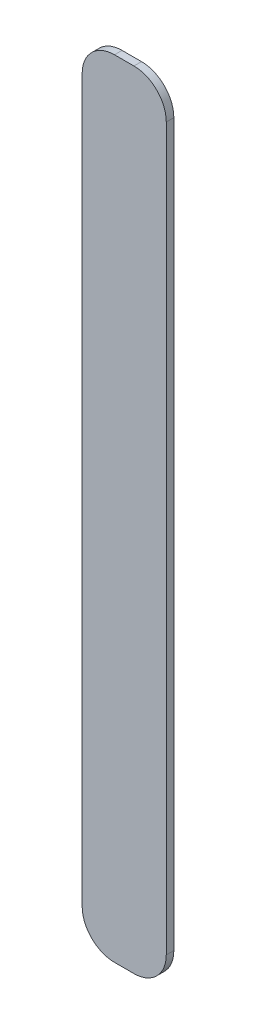
ISO-10303-21;
HEADER;
FILE_DESCRIPTION(('STEP AP214'),'2;1');
FILE_NAME('part.step','',(''),(''),'','','');
FILE_SCHEMA(('AUTOMOTIVE_DESIGN { 1 0 10303 214 1 1 1 1 }'));
ENDSEC;
DATA;
#1=APPLICATION_CONTEXT('core data for automotive mechanical design processes');
#2=APPLICATION_PROTOCOL_DEFINITION('international standard','automotive_design',2000,#1);
#3=PRODUCT_CONTEXT('',#1,'mechanical');
#4=PRODUCT('Part','Part','',(#3));
#5=PRODUCT_RELATED_PRODUCT_CATEGORY('part','',(#4));
#6=PRODUCT_DEFINITION_FORMATION('','',#4);
#7=PRODUCT_DEFINITION_CONTEXT('part definition',#1,'design');
#8=PRODUCT_DEFINITION('design','',#6,#7);
#9=PRODUCT_DEFINITION_SHAPE('','',#8);
#10=(LENGTH_UNIT() NAMED_UNIT(*) SI_UNIT(.MILLI.,.METRE.));
#11=(NAMED_UNIT(*) PLANE_ANGLE_UNIT() SI_UNIT($,.RADIAN.));
#12=(NAMED_UNIT(*) SI_UNIT($,.STERADIAN.) SOLID_ANGLE_UNIT());
#13=UNCERTAINTY_MEASURE_WITH_UNIT(LENGTH_MEASURE(1.E-05),#10,'distance_accuracy_value','');
#14=(GEOMETRIC_REPRESENTATION_CONTEXT(3) GLOBAL_UNCERTAINTY_ASSIGNED_CONTEXT((#13)) GLOBAL_UNIT_ASSIGNED_CONTEXT((#10,
#11,#12)) REPRESENTATION_CONTEXT('',''));
#15=CARTESIAN_POINT('',(0.,0.,0.));
#16=DIRECTION('',(0.,0.,1.));
#17=DIRECTION('',(1.,0.,0.));
#18=AXIS2_PLACEMENT_3D('',#15,#16,#17);
#19=CARTESIAN_POINT('',(0.,0.,-1.17));
#20=DIRECTION('',(-1.,0.,0.));
#21=DIRECTION('',(0.,0.,1.));
#22=AXIS2_PLACEMENT_3D('',#19,#20,#21);
#23=PLANE('',#22);
#24=DIRECTION('',(0.,-1.,0.));
#25=VECTOR('',#24,1.);
#26=CARTESIAN_POINT('',(0.,0.,0.));
#27=LINE('',#26,#25);
#28=CARTESIAN_POINT('',(0.,116.5,0.));
#29=VERTEX_POINT('',#28);
#30=CARTESIAN_POINT('',(0.,5.,0.));
#31=VERTEX_POINT('',#30);
#32=EDGE_CURVE('E162',#29,#31,#27,.T.);
#33=ORIENTED_EDGE('',*,*,#32,.F.);
#34=DIRECTION('',(0.,0.,1.));
#35=VECTOR('',#34,1.);
#36=CARTESIAN_POINT('',(0.,116.5,-1.17));
#37=LINE('',#36,#35);
#38=CARTESIAN_POINT('',(0.,116.5,-1.17));
#39=VERTEX_POINT('',#38);
#40=EDGE_CURVE('E142',#29,#39,#37,.F.);
#41=ORIENTED_EDGE('',*,*,#40,.T.);
#42=DIRECTION('',(0.,-1.,0.));
#43=VECTOR('',#42,1.);
#44=CARTESIAN_POINT('',(0.,0.,-1.17));
#45=LINE('',#44,#43);
#46=CARTESIAN_POINT('',(0.,5.,-1.17));
#47=VERTEX_POINT('',#46);
#48=EDGE_CURVE('E123',#39,#47,#45,.T.);
#49=ORIENTED_EDGE('',*,*,#48,.T.);
#50=DIRECTION('',(0.,0.,1.));
#51=VECTOR('',#50,1.);
#52=CARTESIAN_POINT('',(0.,5.,-1.17));
#53=LINE('',#52,#51);
#54=EDGE_CURVE('E139',#47,#31,#53,.T.);
#55=ORIENTED_EDGE('',*,*,#54,.T.);
#56=EDGE_LOOP('',(#33,#41,#49,#55));
#57=FACE_BOUND('',#56,.T.);
#58=ADVANCED_FACE('F37',(#57),#23,.T.);
#59=CARTESIAN_POINT('',(0.,121.5,-1.17));
#60=DIRECTION('',(0.,1.,0.));
#61=DIRECTION('',(0.,0.,1.));
#62=AXIS2_PLACEMENT_3D('',#59,#60,#61);
#63=PLANE('',#62);
#64=DIRECTION('',(-1.,0.,0.));
#65=VECTOR('',#64,1.);
#66=CARTESIAN_POINT('',(0.,121.5,-1.17));
#67=LINE('',#66,#65);
#68=CARTESIAN_POINT('',(8.,121.5,-1.17));
#69=VERTEX_POINT('',#68);
#70=CARTESIAN_POINT('',(5.,121.5,-1.17));
#71=VERTEX_POINT('',#70);
#72=EDGE_CURVE('E127',#69,#71,#67,.T.);
#73=ORIENTED_EDGE('',*,*,#72,.T.);
#74=DIRECTION('',(0.,0.,1.));
#75=VECTOR('',#74,1.);
#76=CARTESIAN_POINT('',(5.,121.5,-1.17));
#77=LINE('',#76,#75);
#78=CARTESIAN_POINT('',(5.,121.5,0.));
#79=VERTEX_POINT('',#78);
#80=EDGE_CURVE('E114',#71,#79,#77,.T.);
#81=ORIENTED_EDGE('',*,*,#80,.T.);
#82=DIRECTION('',(-1.,0.,0.));
#83=VECTOR('',#82,1.);
#84=CARTESIAN_POINT('',(0.,121.5,0.));
#85=LINE('',#84,#83);
#86=CARTESIAN_POINT('',(8.,121.5,0.));
#87=VERTEX_POINT('',#86);
#88=EDGE_CURVE('E106',#87,#79,#85,.T.);
#89=ORIENTED_EDGE('',*,*,#88,.F.);
#90=DIRECTION('',(0.,0.,1.));
#91=VECTOR('',#90,1.);
#92=CARTESIAN_POINT('',(8.,121.5,-1.17));
#93=LINE('',#92,#91);
#94=EDGE_CURVE('E120',#87,#69,#93,.F.);
#95=ORIENTED_EDGE('',*,*,#94,.T.);
#96=EDGE_LOOP('',(#73,#81,#89,#95));
#97=FACE_BOUND('',#96,.T.);
#98=ADVANCED_FACE('F119',(#97),#63,.T.);
#99=CARTESIAN_POINT('',(13.,0.,-1.17));
#100=DIRECTION('',(1.,0.,0.));
#101=DIRECTION('',(0.,0.,-1.));
#102=AXIS2_PLACEMENT_3D('',#99,#100,#101);
#103=PLANE('',#102);
#104=DIRECTION('',(0.,1.,0.));
#105=VECTOR('',#104,1.);
#106=CARTESIAN_POINT('',(13.,0.,0.));
#107=LINE('',#106,#105);
#108=CARTESIAN_POINT('',(13.,5.,0.));
#109=VERTEX_POINT('',#108);
#110=CARTESIAN_POINT('',(13.,116.5,0.));
#111=VERTEX_POINT('',#110);
#112=EDGE_CURVE('E108',#109,#111,#107,.T.);
#113=ORIENTED_EDGE('',*,*,#112,.F.);
#114=DIRECTION('',(0.,0.,1.));
#115=VECTOR('',#114,1.);
#116=CARTESIAN_POINT('',(13.,5.,-1.17));
#117=LINE('',#116,#115);
#118=CARTESIAN_POINT('',(13.,5.,-1.17));
#119=VERTEX_POINT('',#118);
#120=EDGE_CURVE('E11',#109,#119,#117,.F.);
#121=ORIENTED_EDGE('',*,*,#120,.T.);
#122=DIRECTION('',(0.,1.,0.));
#123=VECTOR('',#122,1.);
#124=CARTESIAN_POINT('',(13.,0.,-1.17));
#125=LINE('',#124,#123);
#126=CARTESIAN_POINT('',(13.,116.5,-1.17));
#127=VERTEX_POINT('',#126);
#128=EDGE_CURVE('E130',#119,#127,#125,.T.);
#129=ORIENTED_EDGE('',*,*,#128,.T.);
#130=DIRECTION('',(0.,0.,1.));
#131=VECTOR('',#130,1.);
#132=CARTESIAN_POINT('',(13.,116.5,-1.17));
#133=LINE('',#132,#131);
#134=EDGE_CURVE('E45',#127,#111,#133,.T.);
#135=ORIENTED_EDGE('',*,*,#134,.T.);
#136=EDGE_LOOP('',(#113,#121,#129,#135));
#137=FACE_BOUND('',#136,.T.);
#138=ADVANCED_FACE('F155',(#137),#103,.T.);
#139=CARTESIAN_POINT('',(0.,0.,-1.17));
#140=DIRECTION('',(0.,-1.,0.));
#141=DIRECTION('',(0.,0.,-1.));
#142=AXIS2_PLACEMENT_3D('',#139,#140,#141);
#143=PLANE('',#142);
#144=DIRECTION('',(1.,0.,0.));
#145=VECTOR('',#144,1.);
#146=CARTESIAN_POINT('',(0.,0.,0.));
#147=LINE('',#146,#145);
#148=CARTESIAN_POINT('',(5.,0.,0.));
#149=VERTEX_POINT('',#148);
#150=CARTESIAN_POINT('',(8.,0.,0.));
#151=VERTEX_POINT('',#150);
#152=EDGE_CURVE('E165',#149,#151,#147,.T.);
#153=ORIENTED_EDGE('',*,*,#152,.F.);
#154=DIRECTION('',(0.,0.,1.));
#155=VECTOR('',#154,1.);
#156=CARTESIAN_POINT('',(5.,0.,-1.17));
#157=LINE('',#156,#155);
#158=CARTESIAN_POINT('',(5.,0.,-1.17));
#159=VERTEX_POINT('',#158);
#160=EDGE_CURVE('E59',#149,#159,#157,.F.);
#161=ORIENTED_EDGE('',*,*,#160,.T.);
#162=DIRECTION('',(1.,0.,0.));
#163=VECTOR('',#162,1.);
#164=CARTESIAN_POINT('',(0.,0.,-1.17));
#165=LINE('',#164,#163);
#166=CARTESIAN_POINT('',(8.,0.,-1.17));
#167=VERTEX_POINT('',#166);
#168=EDGE_CURVE('E157',#159,#167,#165,.T.);
#169=ORIENTED_EDGE('',*,*,#168,.T.);
#170=DIRECTION('',(0.,0.,1.));
#171=VECTOR('',#170,1.);
#172=CARTESIAN_POINT('',(8.,0.,-1.17));
#173=LINE('',#172,#171);
#174=EDGE_CURVE('E150',#167,#151,#173,.T.);
#175=ORIENTED_EDGE('',*,*,#174,.T.);
#176=EDGE_LOOP('',(#153,#161,#169,#175));
#177=FACE_BOUND('',#176,.T.);
#178=ADVANCED_FACE('F167',(#177),#143,.T.);
#179=CARTESIAN_POINT('',(0.,0.,-1.17));
#180=DIRECTION('',(0.,0.,-1.));
#181=DIRECTION('',(-1.,0.,0.));
#182=AXIS2_PLACEMENT_3D('',#179,#180,#181);
#183=PLANE('',#182);
#184=ORIENTED_EDGE('',*,*,#48,.F.);
#185=CARTESIAN_POINT('',(5.,116.5,-1.17));
#186=DIRECTION('',(0.,0.,-1.));
#187=DIRECTION('',(-1.,0.,0.));
#188=AXIS2_PLACEMENT_3D('',#185,#186,#187);
#189=CIRCLE('',#188,5.);
#190=EDGE_CURVE('E148',#39,#71,#189,.T.);
#191=ORIENTED_EDGE('',*,*,#190,.T.);
#192=ORIENTED_EDGE('',*,*,#72,.F.);
#193=CARTESIAN_POINT('',(8.,116.5,-1.17));
#194=DIRECTION('',(0.,0.,-1.));
#195=DIRECTION('',(-1.,0.,0.));
#196=AXIS2_PLACEMENT_3D('',#193,#194,#195);
#197=CIRCLE('',#196,5.);
#198=EDGE_CURVE('E126',#69,#127,#197,.T.);
#199=ORIENTED_EDGE('',*,*,#198,.T.);
#200=ORIENTED_EDGE('',*,*,#128,.F.);
#201=CARTESIAN_POINT('',(8.,5.,-1.17));
#202=DIRECTION('',(0.,0.,-1.));
#203=DIRECTION('',(-1.,0.,0.));
#204=AXIS2_PLACEMENT_3D('',#201,#202,#203);
#205=CIRCLE('',#204,5.);
#206=EDGE_CURVE('E52',#119,#167,#205,.T.);
#207=ORIENTED_EDGE('',*,*,#206,.T.);
#208=ORIENTED_EDGE('',*,*,#168,.F.);
#209=CARTESIAN_POINT('',(5.,5.,-1.17));
#210=DIRECTION('',(0.,0.,-1.));
#211=DIRECTION('',(-1.,0.,0.));
#212=AXIS2_PLACEMENT_3D('',#209,#210,#211);
#213=CIRCLE('',#212,5.);
#214=EDGE_CURVE('E146',#159,#47,#213,.T.);
#215=ORIENTED_EDGE('',*,*,#214,.T.);
#216=EDGE_LOOP('',(#184,#191,#192,#199,#200,#207,#208,#215));
#217=FACE_BOUND('',#216,.T.);
#218=ADVANCED_FACE('F175',(#217),#183,.T.);
#219=CARTESIAN_POINT('',(0.,0.,0.));
#220=DIRECTION('',(0.,0.,-1.));
#221=DIRECTION('',(-1.,0.,0.));
#222=AXIS2_PLACEMENT_3D('',#219,#220,#221);
#223=PLANE('',#222);
#224=ORIENTED_EDGE('',*,*,#88,.T.);
#225=CARTESIAN_POINT('',(5.,116.5,0.));
#226=DIRECTION('',(0.,0.,-1.));
#227=DIRECTION('',(-1.,0.,0.));
#228=AXIS2_PLACEMENT_3D('',#225,#226,#227);
#229=CIRCLE('',#228,5.);
#230=EDGE_CURVE('E137',#79,#29,#229,.F.);
#231=ORIENTED_EDGE('',*,*,#230,.T.);
#232=ORIENTED_EDGE('',*,*,#32,.T.);
#233=CARTESIAN_POINT('',(5.,5.,0.));
#234=DIRECTION('',(0.,0.,-1.));
#235=DIRECTION('',(-1.,0.,0.));
#236=AXIS2_PLACEMENT_3D('',#233,#234,#235);
#237=CIRCLE('',#236,5.);
#238=EDGE_CURVE('E135',#31,#149,#237,.F.);
#239=ORIENTED_EDGE('',*,*,#238,.T.);
#240=ORIENTED_EDGE('',*,*,#152,.T.);
#241=CARTESIAN_POINT('',(8.,5.,0.));
#242=DIRECTION('',(0.,0.,-1.));
#243=DIRECTION('',(-1.,0.,0.));
#244=AXIS2_PLACEMENT_3D('',#241,#242,#243);
#245=CIRCLE('',#244,5.);
#246=EDGE_CURVE('E113',#151,#109,#245,.F.);
#247=ORIENTED_EDGE('',*,*,#246,.T.);
#248=ORIENTED_EDGE('',*,*,#112,.T.);
#249=CARTESIAN_POINT('',(8.,116.5,0.));
#250=DIRECTION('',(0.,0.,-1.));
#251=DIRECTION('',(-1.,0.,0.));
#252=AXIS2_PLACEMENT_3D('',#249,#250,#251);
#253=CIRCLE('',#252,5.);
#254=EDGE_CURVE('E103',#111,#87,#253,.F.);
#255=ORIENTED_EDGE('',*,*,#254,.T.);
#256=EDGE_LOOP('',(#224,#231,#232,#239,#240,#247,#248,#255));
#257=FACE_BOUND('',#256,.T.);
#258=ADVANCED_FACE('F105',(#257),#223,.F.);
#259=CARTESIAN_POINT('',(5.,116.5,-1.17));
#260=DIRECTION('',(0.,0.,1.));
#261=DIRECTION('',(1.,0.,0.));
#262=AXIS2_PLACEMENT_3D('',#259,#260,#261);
#263=CYLINDRICAL_SURFACE('',#262,5.);
#264=ORIENTED_EDGE('',*,*,#190,.F.);
#265=ORIENTED_EDGE('',*,*,#40,.F.);
#266=ORIENTED_EDGE('',*,*,#230,.F.);
#267=ORIENTED_EDGE('',*,*,#80,.F.);
#268=EDGE_LOOP('',(#264,#265,#266,#267));
#269=FACE_BOUND('',#268,.T.);
#270=ADVANCED_FACE('F181',(#269),#263,.T.);
#271=CARTESIAN_POINT('',(5.,5.,-1.17));
#272=DIRECTION('',(0.,0.,1.));
#273=DIRECTION('',(1.,0.,0.));
#274=AXIS2_PLACEMENT_3D('',#271,#272,#273);
#275=CYLINDRICAL_SURFACE('',#274,5.);
#276=ORIENTED_EDGE('',*,*,#214,.F.);
#277=ORIENTED_EDGE('',*,*,#160,.F.);
#278=ORIENTED_EDGE('',*,*,#238,.F.);
#279=ORIENTED_EDGE('',*,*,#54,.F.);
#280=EDGE_LOOP('',(#276,#277,#278,#279));
#281=FACE_BOUND('',#280,.T.);
#282=ADVANCED_FACE('F171',(#281),#275,.T.);
#283=CARTESIAN_POINT('',(8.,5.,-1.17));
#284=DIRECTION('',(0.,0.,1.));
#285=DIRECTION('',(1.,0.,0.));
#286=AXIS2_PLACEMENT_3D('',#283,#284,#285);
#287=CYLINDRICAL_SURFACE('',#286,5.);
#288=ORIENTED_EDGE('',*,*,#206,.F.);
#289=ORIENTED_EDGE('',*,*,#120,.F.);
#290=ORIENTED_EDGE('',*,*,#246,.F.);
#291=ORIENTED_EDGE('',*,*,#174,.F.);
#292=EDGE_LOOP('',(#288,#289,#290,#291));
#293=FACE_BOUND('',#292,.T.);
#294=ADVANCED_FACE('F188',(#293),#287,.T.);
#295=CARTESIAN_POINT('',(8.,116.5,-1.17));
#296=DIRECTION('',(0.,0.,1.));
#297=DIRECTION('',(1.,0.,0.));
#298=AXIS2_PLACEMENT_3D('',#295,#296,#297);
#299=CYLINDRICAL_SURFACE('',#298,5.);
#300=ORIENTED_EDGE('',*,*,#198,.F.);
#301=ORIENTED_EDGE('',*,*,#94,.F.);
#302=ORIENTED_EDGE('',*,*,#254,.F.);
#303=ORIENTED_EDGE('',*,*,#134,.F.);
#304=EDGE_LOOP('',(#300,#301,#302,#303));
#305=FACE_BOUND('',#304,.T.);
#306=ADVANCED_FACE('F39',(#305),#299,.T.);
#307=CLOSED_SHELL('',(#58,#98,#138,#178,#218,#258,#270,#282,#294,#306));
#308=MANIFOLD_SOLID_BREP('B2',#307);
#309=ADVANCED_BREP_SHAPE_REPRESENTATION('',(#18,#308),#14);
#310=SHAPE_DEFINITION_REPRESENTATION(#9,#309);
ENDSEC;
END-ISO-10303-21;
